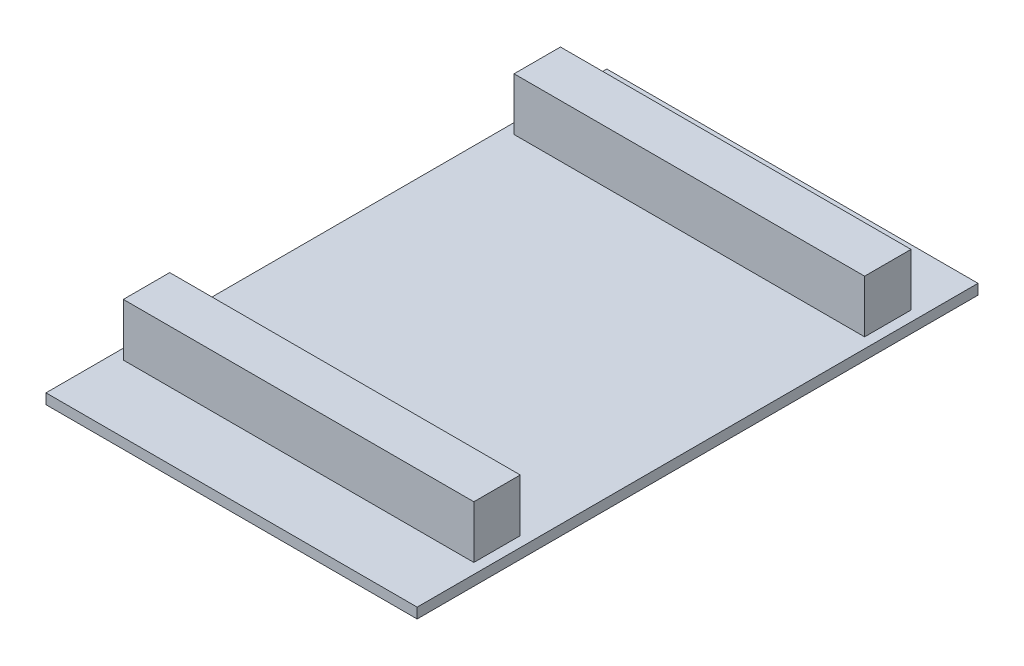
ISO-10303-21;
HEADER;
FILE_DESCRIPTION(('STEP AP214'),'2;1');
FILE_NAME('part.step','',(''),(''),'','','');
FILE_SCHEMA(('AUTOMOTIVE_DESIGN { 1 0 10303 214 1 1 1 1 }'));
ENDSEC;
DATA;
#1=APPLICATION_CONTEXT('core data for automotive mechanical design processes');
#2=APPLICATION_PROTOCOL_DEFINITION('international standard','automotive_design',2000,#1);
#3=PRODUCT_CONTEXT('',#1,'mechanical');
#4=PRODUCT('Part','Part','',(#3));
#5=PRODUCT_RELATED_PRODUCT_CATEGORY('part','',(#4));
#6=PRODUCT_DEFINITION_FORMATION('','',#4);
#7=PRODUCT_DEFINITION_CONTEXT('part definition',#1,'design');
#8=PRODUCT_DEFINITION('design','',#6,#7);
#9=PRODUCT_DEFINITION_SHAPE('','',#8);
#10=(LENGTH_UNIT() NAMED_UNIT(*) SI_UNIT(.MILLI.,.METRE.));
#11=(NAMED_UNIT(*) PLANE_ANGLE_UNIT() SI_UNIT($,.RADIAN.));
#12=(NAMED_UNIT(*) SI_UNIT($,.STERADIAN.) SOLID_ANGLE_UNIT());
#13=UNCERTAINTY_MEASURE_WITH_UNIT(LENGTH_MEASURE(1.E-05),#10,'distance_accuracy_value','');
#14=(GEOMETRIC_REPRESENTATION_CONTEXT(3) GLOBAL_UNCERTAINTY_ASSIGNED_CONTEXT((#13)) GLOBAL_UNIT_ASSIGNED_CONTEXT((#10,
#11,#12)) REPRESENTATION_CONTEXT('',''));
#15=CARTESIAN_POINT('',(0.,0.,0.));
#16=DIRECTION('',(0.,0.,1.));
#17=DIRECTION('',(1.,0.,0.));
#18=AXIS2_PLACEMENT_3D('',#15,#16,#17);
#19=CARTESIAN_POINT('',(0.,1.,0.));
#20=DIRECTION('',(0.,1.,0.));
#21=DIRECTION('',(0.,0.,1.));
#22=AXIS2_PLACEMENT_3D('',#19,#20,#21);
#23=PLANE('',#22);
#24=DIRECTION('',(0.,0.,-1.));
#25=VECTOR('',#24,1.);
#26=CARTESIAN_POINT('',(18.,1.,-27.2));
#27=LINE('',#26,#25);
#28=CARTESIAN_POINT('',(18.,1.,27.2));
#29=VERTEX_POINT('',#28);
#30=CARTESIAN_POINT('',(18.,1.,-27.2));
#31=VERTEX_POINT('',#30);
#32=EDGE_CURVE('E180',#29,#31,#27,.T.);
#33=ORIENTED_EDGE('',*,*,#32,.T.);
#34=DIRECTION('',(-1.,0.,0.));
#35=VECTOR('',#34,1.);
#36=CARTESIAN_POINT('',(-18.,1.,-27.2));
#37=LINE('',#36,#35);
#38=CARTESIAN_POINT('',(-18.,1.,-27.2));
#39=VERTEX_POINT('',#38);
#40=EDGE_CURVE('E183',#31,#39,#37,.T.);
#41=ORIENTED_EDGE('',*,*,#40,.T.);
#42=DIRECTION('',(0.,0.,1.));
#43=VECTOR('',#42,1.);
#44=CARTESIAN_POINT('',(-18.,1.,-27.2));
#45=LINE('',#44,#43);
#46=CARTESIAN_POINT('',(-18.,1.,27.2));
#47=VERTEX_POINT('',#46);
#48=EDGE_CURVE('E186',#39,#47,#45,.T.);
#49=ORIENTED_EDGE('',*,*,#48,.T.);
#50=DIRECTION('',(1.,0.,0.));
#51=VECTOR('',#50,1.);
#52=CARTESIAN_POINT('',(-18.,1.,27.2));
#53=LINE('',#52,#51);
#54=EDGE_CURVE('E188',#47,#29,#53,.T.);
#55=ORIENTED_EDGE('',*,*,#54,.T.);
#56=EDGE_LOOP('',(#33,#41,#49,#55));
#57=FACE_BOUND('',#56,.T.);
#58=DIRECTION('',(-1.,0.,0.));
#59=VECTOR('',#58,1.);
#60=CARTESIAN_POINT('',(17.,1.,-21.7));
#61=LINE('',#60,#59);
#62=CARTESIAN_POINT('',(17.,1.,-21.7));
#63=VERTEX_POINT('',#62);
#64=CARTESIAN_POINT('',(-17.,1.,-21.7));
#65=VERTEX_POINT('',#64);
#66=EDGE_CURVE('E151',#63,#65,#61,.T.);
#67=ORIENTED_EDGE('',*,*,#66,.F.);
#68=DIRECTION('',(0.,0.,-1.));
#69=VECTOR('',#68,1.);
#70=CARTESIAN_POINT('',(17.,1.,-21.7));
#71=LINE('',#70,#69);
#72=CARTESIAN_POINT('',(17.,1.,-17.2));
#73=VERTEX_POINT('',#72);
#74=EDGE_CURVE('E148',#73,#63,#71,.T.);
#75=ORIENTED_EDGE('',*,*,#74,.F.);
#76=DIRECTION('',(1.,0.,0.));
#77=VECTOR('',#76,1.);
#78=CARTESIAN_POINT('',(17.,1.,-17.2));
#79=LINE('',#78,#77);
#80=CARTESIAN_POINT('',(-17.,1.,-17.2));
#81=VERTEX_POINT('',#80);
#82=EDGE_CURVE('E160',#81,#73,#79,.T.);
#83=ORIENTED_EDGE('',*,*,#82,.F.);
#84=DIRECTION('',(0.,0.,1.));
#85=VECTOR('',#84,1.);
#86=CARTESIAN_POINT('',(-17.,1.,-21.7));
#87=LINE('',#86,#85);
#88=EDGE_CURVE('E168',#65,#81,#87,.T.);
#89=ORIENTED_EDGE('',*,*,#88,.F.);
#90=EDGE_LOOP('',(#67,#75,#83,#89));
#91=FACE_BOUND('',#90,.T.);
#92=DIRECTION('',(1.,0.,0.));
#93=VECTOR('',#92,1.);
#94=CARTESIAN_POINT('',(-17.,1.,20.7));
#95=LINE('',#94,#93);
#96=CARTESIAN_POINT('',(-17.,1.,20.7));
#97=VERTEX_POINT('',#96);
#98=CARTESIAN_POINT('',(17.,1.,20.7));
#99=VERTEX_POINT('',#98);
#100=EDGE_CURVE('E369',#97,#99,#95,.T.);
#101=ORIENTED_EDGE('',*,*,#100,.F.);
#102=DIRECTION('',(0.,0.,1.));
#103=VECTOR('',#102,1.);
#104=CARTESIAN_POINT('',(-17.,1.,16.2));
#105=LINE('',#104,#103);
#106=CARTESIAN_POINT('',(-17.,1.,16.2));
#107=VERTEX_POINT('',#106);
#108=EDGE_CURVE('E146',#107,#97,#105,.T.);
#109=ORIENTED_EDGE('',*,*,#108,.F.);
#110=DIRECTION('',(-1.,0.,0.));
#111=VECTOR('',#110,1.);
#112=CARTESIAN_POINT('',(-17.,1.,16.2));
#113=LINE('',#112,#111);
#114=CARTESIAN_POINT('',(17.,1.,16.2));
#115=VERTEX_POINT('',#114);
#116=EDGE_CURVE('E142',#115,#107,#113,.T.);
#117=ORIENTED_EDGE('',*,*,#116,.F.);
#118=DIRECTION('',(0.,0.,-1.));
#119=VECTOR('',#118,1.);
#120=CARTESIAN_POINT('',(17.,1.,16.2));
#121=LINE('',#120,#119);
#122=EDGE_CURVE('E366',#99,#115,#121,.T.);
#123=ORIENTED_EDGE('',*,*,#122,.F.);
#124=EDGE_LOOP('',(#101,#109,#117,#123));
#125=FACE_BOUND('',#124,.T.);
#126=ADVANCED_FACE('F33',(#57,#91,#125),#23,.T.);
#127=CARTESIAN_POINT('',(18.,1.,-27.2));
#128=DIRECTION('',(-1.,0.,0.));
#129=DIRECTION('',(0.,0.,1.));
#130=AXIS2_PLACEMENT_3D('',#127,#128,#129);
#131=PLANE('',#130);
#132=DIRECTION('',(0.,0.,-1.));
#133=VECTOR('',#132,1.);
#134=CARTESIAN_POINT('',(18.,0.,-27.2));
#135=LINE('',#134,#133);
#136=CARTESIAN_POINT('',(18.,0.,27.2));
#137=VERTEX_POINT('',#136);
#138=CARTESIAN_POINT('',(18.,0.,-27.2));
#139=VERTEX_POINT('',#138);
#140=EDGE_CURVE('E179',#137,#139,#135,.T.);
#141=ORIENTED_EDGE('',*,*,#140,.T.);
#142=DIRECTION('',(0.,-1.,0.));
#143=VECTOR('',#142,1.);
#144=CARTESIAN_POINT('',(18.,1.,-27.2));
#145=LINE('',#144,#143);
#146=EDGE_CURVE('E11',#31,#139,#145,.T.);
#147=ORIENTED_EDGE('',*,*,#146,.F.);
#148=ORIENTED_EDGE('',*,*,#32,.F.);
#149=DIRECTION('',(0.,-1.,0.));
#150=VECTOR('',#149,1.);
#151=CARTESIAN_POINT('',(18.,1.,27.2));
#152=LINE('',#151,#150);
#153=EDGE_CURVE('E190',#29,#137,#152,.T.);
#154=ORIENTED_EDGE('',*,*,#153,.T.);
#155=EDGE_LOOP('',(#141,#147,#148,#154));
#156=FACE_BOUND('',#155,.T.);
#157=ADVANCED_FACE('F35',(#156),#131,.F.);
#158=CARTESIAN_POINT('',(-18.,1.,-27.2));
#159=DIRECTION('',(0.,0.,1.));
#160=DIRECTION('',(1.,0.,0.));
#161=AXIS2_PLACEMENT_3D('',#158,#159,#160);
#162=PLANE('',#161);
#163=DIRECTION('',(-1.,0.,0.));
#164=VECTOR('',#163,1.);
#165=CARTESIAN_POINT('',(-18.,0.,-27.2));
#166=LINE('',#165,#164);
#167=CARTESIAN_POINT('',(-18.,0.,-27.2));
#168=VERTEX_POINT('',#167);
#169=EDGE_CURVE('E193',#139,#168,#166,.T.);
#170=ORIENTED_EDGE('',*,*,#169,.T.);
#171=DIRECTION('',(0.,-1.,0.));
#172=VECTOR('',#171,1.);
#173=CARTESIAN_POINT('',(-18.,1.,-27.2));
#174=LINE('',#173,#172);
#175=EDGE_CURVE('E41',#39,#168,#174,.T.);
#176=ORIENTED_EDGE('',*,*,#175,.F.);
#177=ORIENTED_EDGE('',*,*,#40,.F.);
#178=ORIENTED_EDGE('',*,*,#146,.T.);
#179=EDGE_LOOP('',(#170,#176,#177,#178));
#180=FACE_BOUND('',#179,.T.);
#181=ADVANCED_FACE('F223',(#180),#162,.F.);
#182=CARTESIAN_POINT('',(-18.,1.,-27.2));
#183=DIRECTION('',(1.,0.,0.));
#184=DIRECTION('',(0.,0.,-1.));
#185=AXIS2_PLACEMENT_3D('',#182,#183,#184);
#186=PLANE('',#185);
#187=DIRECTION('',(0.,0.,1.));
#188=VECTOR('',#187,1.);
#189=CARTESIAN_POINT('',(-18.,0.,-27.2));
#190=LINE('',#189,#188);
#191=CARTESIAN_POINT('',(-18.,0.,27.2));
#192=VERTEX_POINT('',#191);
#193=EDGE_CURVE('E195',#168,#192,#190,.T.);
#194=ORIENTED_EDGE('',*,*,#193,.T.);
#195=DIRECTION('',(0.,-1.,0.));
#196=VECTOR('',#195,1.);
#197=CARTESIAN_POINT('',(-18.,1.,27.2));
#198=LINE('',#197,#196);
#199=EDGE_CURVE('E200',#47,#192,#198,.T.);
#200=ORIENTED_EDGE('',*,*,#199,.F.);
#201=ORIENTED_EDGE('',*,*,#48,.F.);
#202=ORIENTED_EDGE('',*,*,#175,.T.);
#203=EDGE_LOOP('',(#194,#200,#201,#202));
#204=FACE_BOUND('',#203,.T.);
#205=ADVANCED_FACE('F207',(#204),#186,.F.);
#206=CARTESIAN_POINT('',(-18.,1.,27.2));
#207=DIRECTION('',(0.,0.,-1.));
#208=DIRECTION('',(-1.,0.,0.));
#209=AXIS2_PLACEMENT_3D('',#206,#207,#208);
#210=PLANE('',#209);
#211=DIRECTION('',(1.,0.,0.));
#212=VECTOR('',#211,1.);
#213=CARTESIAN_POINT('',(-18.,0.,27.2));
#214=LINE('',#213,#212);
#215=EDGE_CURVE('E184',#192,#137,#214,.T.);
#216=ORIENTED_EDGE('',*,*,#215,.T.);
#217=ORIENTED_EDGE('',*,*,#153,.F.);
#218=ORIENTED_EDGE('',*,*,#54,.F.);
#219=ORIENTED_EDGE('',*,*,#199,.T.);
#220=EDGE_LOOP('',(#216,#217,#218,#219));
#221=FACE_BOUND('',#220,.T.);
#222=ADVANCED_FACE('F216',(#221),#210,.F.);
#223=CARTESIAN_POINT('',(0.,0.,0.));
#224=DIRECTION('',(0.,1.,0.));
#225=DIRECTION('',(0.,0.,1.));
#226=AXIS2_PLACEMENT_3D('',#223,#224,#225);
#227=PLANE('',#226);
#228=ORIENTED_EDGE('',*,*,#140,.F.);
#229=ORIENTED_EDGE('',*,*,#215,.F.);
#230=ORIENTED_EDGE('',*,*,#193,.F.);
#231=ORIENTED_EDGE('',*,*,#169,.F.);
#232=EDGE_LOOP('',(#228,#229,#230,#231));
#233=FACE_BOUND('',#232,.T.);
#234=ADVANCED_FACE('F213',(#233),#227,.F.);
#235=CARTESIAN_POINT('',(17.,6.1,-21.7));
#236=DIRECTION('',(-1.,0.,0.));
#237=DIRECTION('',(0.,0.,1.));
#238=AXIS2_PLACEMENT_3D('',#235,#236,#237);
#239=PLANE('',#238);
#240=ORIENTED_EDGE('',*,*,#74,.T.);
#241=DIRECTION('',(0.,-1.,0.));
#242=VECTOR('',#241,1.);
#243=CARTESIAN_POINT('',(17.,6.1,-21.7));
#244=LINE('',#243,#242);
#245=CARTESIAN_POINT('',(17.,6.1,-21.7));
#246=VERTEX_POINT('',#245);
#247=EDGE_CURVE('E177',#246,#63,#244,.T.);
#248=ORIENTED_EDGE('',*,*,#247,.F.);
#249=DIRECTION('',(0.,0.,-1.));
#250=VECTOR('',#249,1.);
#251=CARTESIAN_POINT('',(17.,6.1,-21.7));
#252=LINE('',#251,#250);
#253=CARTESIAN_POINT('',(17.,6.1,-17.2));
#254=VERTEX_POINT('',#253);
#255=EDGE_CURVE('E156',#254,#246,#252,.T.);
#256=ORIENTED_EDGE('',*,*,#255,.F.);
#257=DIRECTION('',(0.,-1.,0.));
#258=VECTOR('',#257,1.);
#259=CARTESIAN_POINT('',(17.,6.1,-17.2));
#260=LINE('',#259,#258);
#261=EDGE_CURVE('E165',#254,#73,#260,.T.);
#262=ORIENTED_EDGE('',*,*,#261,.T.);
#263=EDGE_LOOP('',(#240,#248,#256,#262));
#264=FACE_BOUND('',#263,.T.);
#265=ADVANCED_FACE('F236',(#264),#239,.F.);
#266=CARTESIAN_POINT('',(17.,6.1,-21.7));
#267=DIRECTION('',(0.,0.,1.));
#268=DIRECTION('',(1.,0.,0.));
#269=AXIS2_PLACEMENT_3D('',#266,#267,#268);
#270=PLANE('',#269);
#271=ORIENTED_EDGE('',*,*,#66,.T.);
#272=DIRECTION('',(0.,-1.,0.));
#273=VECTOR('',#272,1.);
#274=CARTESIAN_POINT('',(-17.,6.1,-21.7));
#275=LINE('',#274,#273);
#276=CARTESIAN_POINT('',(-17.,6.1,-21.7));
#277=VERTEX_POINT('',#276);
#278=EDGE_CURVE('E174',#277,#65,#275,.T.);
#279=ORIENTED_EDGE('',*,*,#278,.F.);
#280=DIRECTION('',(-1.,0.,0.));
#281=VECTOR('',#280,1.);
#282=CARTESIAN_POINT('',(17.,6.1,-21.7));
#283=LINE('',#282,#281);
#284=EDGE_CURVE('E159',#246,#277,#283,.T.);
#285=ORIENTED_EDGE('',*,*,#284,.F.);
#286=ORIENTED_EDGE('',*,*,#247,.T.);
#287=EDGE_LOOP('',(#271,#279,#285,#286));
#288=FACE_BOUND('',#287,.T.);
#289=ADVANCED_FACE('F255',(#288),#270,.F.);
#290=CARTESIAN_POINT('',(-17.,6.1,-21.7));
#291=DIRECTION('',(1.,0.,0.));
#292=DIRECTION('',(0.,0.,-1.));
#293=AXIS2_PLACEMENT_3D('',#290,#291,#292);
#294=PLANE('',#293);
#295=ORIENTED_EDGE('',*,*,#88,.T.);
#296=DIRECTION('',(0.,-1.,0.));
#297=VECTOR('',#296,1.);
#298=CARTESIAN_POINT('',(-17.,6.1,-17.2));
#299=LINE('',#298,#297);
#300=CARTESIAN_POINT('',(-17.,6.1,-17.2));
#301=VERTEX_POINT('',#300);
#302=EDGE_CURVE('E56',#301,#81,#299,.T.);
#303=ORIENTED_EDGE('',*,*,#302,.F.);
#304=DIRECTION('',(0.,0.,1.));
#305=VECTOR('',#304,1.);
#306=CARTESIAN_POINT('',(-17.,6.1,-21.7));
#307=LINE('',#306,#305);
#308=EDGE_CURVE('E162',#277,#301,#307,.T.);
#309=ORIENTED_EDGE('',*,*,#308,.F.);
#310=ORIENTED_EDGE('',*,*,#278,.T.);
#311=EDGE_LOOP('',(#295,#303,#309,#310));
#312=FACE_BOUND('',#311,.T.);
#313=ADVANCED_FACE('F262',(#312),#294,.F.);
#314=CARTESIAN_POINT('',(17.,6.1,-17.2));
#315=DIRECTION('',(0.,0.,-1.));
#316=DIRECTION('',(-1.,0.,0.));
#317=AXIS2_PLACEMENT_3D('',#314,#315,#316);
#318=PLANE('',#317);
#319=ORIENTED_EDGE('',*,*,#82,.T.);
#320=ORIENTED_EDGE('',*,*,#261,.F.);
#321=DIRECTION('',(1.,0.,0.));
#322=VECTOR('',#321,1.);
#323=CARTESIAN_POINT('',(17.,6.1,-17.2));
#324=LINE('',#323,#322);
#325=EDGE_CURVE('E164',#301,#254,#324,.T.);
#326=ORIENTED_EDGE('',*,*,#325,.F.);
#327=ORIENTED_EDGE('',*,*,#302,.T.);
#328=EDGE_LOOP('',(#319,#320,#326,#327));
#329=FACE_BOUND('',#328,.T.);
#330=ADVANCED_FACE('F269',(#329),#318,.F.);
#331=CARTESIAN_POINT('',(0.,6.1,0.));
#332=DIRECTION('',(0.,-1.,0.));
#333=DIRECTION('',(0.,0.,-1.));
#334=AXIS2_PLACEMENT_3D('',#331,#332,#333);
#335=PLANE('',#334);
#336=ORIENTED_EDGE('',*,*,#255,.T.);
#337=ORIENTED_EDGE('',*,*,#284,.T.);
#338=ORIENTED_EDGE('',*,*,#308,.T.);
#339=ORIENTED_EDGE('',*,*,#325,.T.);
#340=EDGE_LOOP('',(#336,#337,#338,#339));
#341=FACE_BOUND('',#340,.T.);
#342=ADVANCED_FACE('F277',(#341),#335,.F.);
#343=CARTESIAN_POINT('',(-17.,6.1,16.2));
#344=DIRECTION('',(1.,0.,0.));
#345=DIRECTION('',(0.,0.,-1.));
#346=AXIS2_PLACEMENT_3D('',#343,#344,#345);
#347=PLANE('',#346);
#348=ORIENTED_EDGE('',*,*,#108,.T.);
#349=DIRECTION('',(0.,-1.,0.));
#350=VECTOR('',#349,1.);
#351=CARTESIAN_POINT('',(-17.,6.1,20.7));
#352=LINE('',#351,#350);
#353=CARTESIAN_POINT('',(-17.,6.1,20.7));
#354=VERTEX_POINT('',#353);
#355=EDGE_CURVE('E127',#354,#97,#352,.T.);
#356=ORIENTED_EDGE('',*,*,#355,.F.);
#357=DIRECTION('',(0.,0.,1.));
#358=VECTOR('',#357,1.);
#359=CARTESIAN_POINT('',(-17.,6.1,16.2));
#360=LINE('',#359,#358);
#361=CARTESIAN_POINT('',(-17.,6.1,16.2));
#362=VERTEX_POINT('',#361);
#363=EDGE_CURVE('E134',#362,#354,#360,.T.);
#364=ORIENTED_EDGE('',*,*,#363,.F.);
#365=DIRECTION('',(0.,-1.,0.));
#366=VECTOR('',#365,1.);
#367=CARTESIAN_POINT('',(-17.,6.1,16.2));
#368=LINE('',#367,#366);
#369=EDGE_CURVE('E363',#362,#107,#368,.T.);
#370=ORIENTED_EDGE('',*,*,#369,.T.);
#371=EDGE_LOOP('',(#348,#356,#364,#370));
#372=FACE_BOUND('',#371,.T.);
#373=ADVANCED_FACE('F144',(#372),#347,.F.);
#374=CARTESIAN_POINT('',(-17.,6.1,20.7));
#375=DIRECTION('',(0.,0.,-1.));
#376=DIRECTION('',(-1.,0.,0.));
#377=AXIS2_PLACEMENT_3D('',#374,#375,#376);
#378=PLANE('',#377);
#379=ORIENTED_EDGE('',*,*,#100,.T.);
#380=DIRECTION('',(0.,-1.,0.));
#381=VECTOR('',#380,1.);
#382=CARTESIAN_POINT('',(17.,6.1,20.7));
#383=LINE('',#382,#381);
#384=CARTESIAN_POINT('',(17.,6.1,20.7));
#385=VERTEX_POINT('',#384);
#386=EDGE_CURVE('E130',#385,#99,#383,.T.);
#387=ORIENTED_EDGE('',*,*,#386,.F.);
#388=DIRECTION('',(1.,0.,0.));
#389=VECTOR('',#388,1.);
#390=CARTESIAN_POINT('',(-17.,6.1,20.7));
#391=LINE('',#390,#389);
#392=EDGE_CURVE('E123',#354,#385,#391,.T.);
#393=ORIENTED_EDGE('',*,*,#392,.F.);
#394=ORIENTED_EDGE('',*,*,#355,.T.);
#395=EDGE_LOOP('',(#379,#387,#393,#394));
#396=FACE_BOUND('',#395,.T.);
#397=ADVANCED_FACE('F125',(#396),#378,.F.);
#398=CARTESIAN_POINT('',(17.,6.1,16.2));
#399=DIRECTION('',(-1.,0.,0.));
#400=DIRECTION('',(0.,0.,1.));
#401=AXIS2_PLACEMENT_3D('',#398,#399,#400);
#402=PLANE('',#401);
#403=ORIENTED_EDGE('',*,*,#122,.T.);
#404=DIRECTION('',(0.,-1.,0.));
#405=VECTOR('',#404,1.);
#406=CARTESIAN_POINT('',(17.,6.1,16.2));
#407=LINE('',#406,#405);
#408=CARTESIAN_POINT('',(17.,6.1,16.2));
#409=VERTEX_POINT('',#408);
#410=EDGE_CURVE('E48',#409,#115,#407,.T.);
#411=ORIENTED_EDGE('',*,*,#410,.F.);
#412=DIRECTION('',(0.,0.,-1.));
#413=VECTOR('',#412,1.);
#414=CARTESIAN_POINT('',(17.,6.1,16.2));
#415=LINE('',#414,#413);
#416=EDGE_CURVE('E133',#385,#409,#415,.T.);
#417=ORIENTED_EDGE('',*,*,#416,.F.);
#418=ORIENTED_EDGE('',*,*,#386,.T.);
#419=EDGE_LOOP('',(#403,#411,#417,#418));
#420=FACE_BOUND('',#419,.T.);
#421=ADVANCED_FACE('F297',(#420),#402,.F.);
#422=CARTESIAN_POINT('',(-17.,6.1,16.2));
#423=DIRECTION('',(0.,0.,1.));
#424=DIRECTION('',(1.,0.,0.));
#425=AXIS2_PLACEMENT_3D('',#422,#423,#424);
#426=PLANE('',#425);
#427=ORIENTED_EDGE('',*,*,#116,.T.);
#428=ORIENTED_EDGE('',*,*,#369,.F.);
#429=DIRECTION('',(-1.,0.,0.));
#430=VECTOR('',#429,1.);
#431=CARTESIAN_POINT('',(-17.,6.1,16.2));
#432=LINE('',#431,#430);
#433=EDGE_CURVE('E138',#409,#362,#432,.T.);
#434=ORIENTED_EDGE('',*,*,#433,.F.);
#435=ORIENTED_EDGE('',*,*,#410,.T.);
#436=EDGE_LOOP('',(#427,#428,#434,#435));
#437=FACE_BOUND('',#436,.T.);
#438=ADVANCED_FACE('F304',(#437),#426,.F.);
#439=CARTESIAN_POINT('',(0.,6.1,0.));
#440=DIRECTION('',(0.,1.,0.));
#441=DIRECTION('',(0.,0.,1.));
#442=AXIS2_PLACEMENT_3D('',#439,#440,#441);
#443=PLANE('',#442);
#444=ORIENTED_EDGE('',*,*,#363,.T.);
#445=ORIENTED_EDGE('',*,*,#392,.T.);
#446=ORIENTED_EDGE('',*,*,#416,.T.);
#447=ORIENTED_EDGE('',*,*,#433,.T.);
#448=EDGE_LOOP('',(#444,#445,#446,#447));
#449=FACE_BOUND('',#448,.T.);
#450=ADVANCED_FACE('F137',(#449),#443,.T.);
#451=CLOSED_SHELL('',(#126,#157,#181,#205,#222,#234,#265,#289,#313,#330,#342,#373,#397,#421,
#438,#450));
#452=MANIFOLD_SOLID_BREP('B2',#451);
#453=ADVANCED_BREP_SHAPE_REPRESENTATION('',(#18,#452),#14);
#454=SHAPE_DEFINITION_REPRESENTATION(#9,#453);
ENDSEC;
END-ISO-10303-21;
